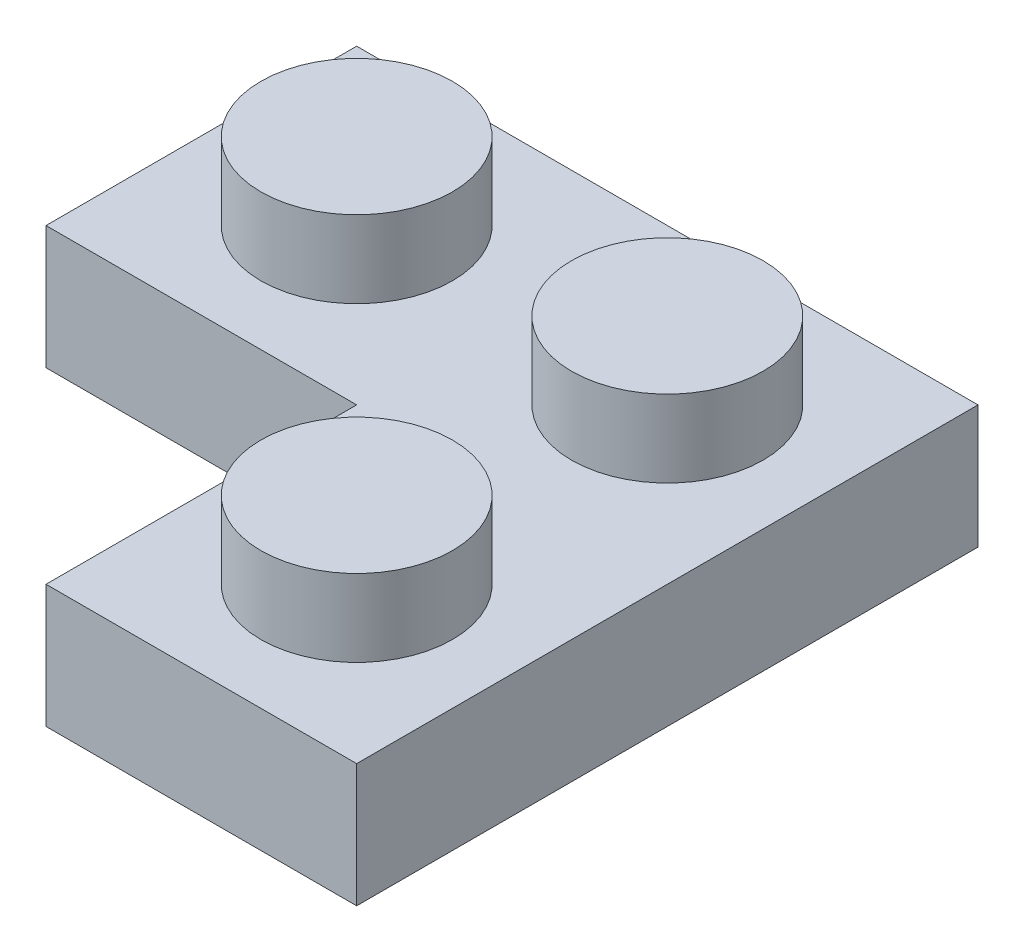
ISO-10303-21;
HEADER;
FILE_DESCRIPTION(('STEP AP214'),'2;1');
FILE_NAME('part.step','',(''),(''),'','','');
FILE_SCHEMA(('AUTOMOTIVE_DESIGN { 1 0 10303 214 1 1 1 1 }'));
ENDSEC;
DATA;
#1=APPLICATION_CONTEXT('core data for automotive mechanical design processes');
#2=APPLICATION_PROTOCOL_DEFINITION('international standard','automotive_design',2000,#1);
#3=PRODUCT_CONTEXT('',#1,'mechanical');
#4=PRODUCT('Part','Part','',(#3));
#5=PRODUCT_RELATED_PRODUCT_CATEGORY('part','',(#4));
#6=PRODUCT_DEFINITION_FORMATION('','',#4);
#7=PRODUCT_DEFINITION_CONTEXT('part definition',#1,'design');
#8=PRODUCT_DEFINITION('design','',#6,#7);
#9=PRODUCT_DEFINITION_SHAPE('','',#8);
#10=(LENGTH_UNIT() NAMED_UNIT(*) SI_UNIT(.MILLI.,.METRE.));
#11=(NAMED_UNIT(*) PLANE_ANGLE_UNIT() SI_UNIT($,.RADIAN.));
#12=(NAMED_UNIT(*) SI_UNIT($,.STERADIAN.) SOLID_ANGLE_UNIT());
#13=UNCERTAINTY_MEASURE_WITH_UNIT(LENGTH_MEASURE(1.E-05),#10,'distance_accuracy_value','');
#14=(GEOMETRIC_REPRESENTATION_CONTEXT(3) GLOBAL_UNCERTAINTY_ASSIGNED_CONTEXT((#13)) GLOBAL_UNIT_ASSIGNED_CONTEXT((#10,
#11,#12)) REPRESENTATION_CONTEXT('',''));
#15=CARTESIAN_POINT('',(0.,0.,0.));
#16=DIRECTION('',(0.,0.,1.));
#17=DIRECTION('',(1.,0.,0.));
#18=AXIS2_PLACEMENT_3D('',#15,#16,#17);
#19=CARTESIAN_POINT('',(0.,-3.15,0.));
#20=DIRECTION('',(0.,-1.,0.));
#21=DIRECTION('',(0.,0.,-1.));
#22=AXIS2_PLACEMENT_3D('',#19,#20,#21);
#23=PLANE('',#22);
#24=DIRECTION('',(1.,0.,0.));
#25=VECTOR('',#24,1.);
#26=CARTESIAN_POINT('',(-7.945,-3.15,0.));
#27=LINE('',#26,#25);
#28=CARTESIAN_POINT('',(-7.945,-3.15,0.));
#29=VERTEX_POINT('',#28);
#30=CARTESIAN_POINT('',(0.,-3.15,0.));
#31=VERTEX_POINT('',#30);
#32=EDGE_CURVE('E151',#29,#31,#27,.T.);
#33=ORIENTED_EDGE('',*,*,#32,.F.);
#34=DIRECTION('',(0.,0.,1.));
#35=VECTOR('',#34,1.);
#36=CARTESIAN_POINT('',(-7.945,-3.15,-7.945));
#37=LINE('',#36,#35);
#38=CARTESIAN_POINT('',(-7.945,-3.15,-7.945));
#39=VERTEX_POINT('',#38);
#40=EDGE_CURVE('E125',#39,#29,#37,.T.);
#41=ORIENTED_EDGE('',*,*,#40,.F.);
#42=DIRECTION('',(-1.,0.,0.));
#43=VECTOR('',#42,1.);
#44=CARTESIAN_POINT('',(7.945,-3.15,-7.945));
#45=LINE('',#44,#43);
#46=CARTESIAN_POINT('',(7.945,-3.15,-7.945));
#47=VERTEX_POINT('',#46);
#48=EDGE_CURVE('E108',#47,#39,#45,.T.);
#49=ORIENTED_EDGE('',*,*,#48,.F.);
#50=DIRECTION('',(0.,0.,-1.));
#51=VECTOR('',#50,1.);
#52=CARTESIAN_POINT('',(7.945,-3.15,7.945));
#53=LINE('',#52,#51);
#54=CARTESIAN_POINT('',(7.945,-3.15,7.945));
#55=VERTEX_POINT('',#54);
#56=EDGE_CURVE('E123',#55,#47,#53,.T.);
#57=ORIENTED_EDGE('',*,*,#56,.F.);
#58=DIRECTION('',(1.,0.,0.));
#59=VECTOR('',#58,1.);
#60=CARTESIAN_POINT('',(0.,-3.15,7.945));
#61=LINE('',#60,#59);
#62=CARTESIAN_POINT('',(0.,-3.15,7.945));
#63=VERTEX_POINT('',#62);
#64=EDGE_CURVE('E128',#63,#55,#61,.T.);
#65=ORIENTED_EDGE('',*,*,#64,.F.);
#66=DIRECTION('',(0.,0.,1.));
#67=VECTOR('',#66,1.);
#68=CARTESIAN_POINT('',(0.,-3.15,0.));
#69=LINE('',#68,#67);
#70=EDGE_CURVE('E130',#31,#63,#69,.T.);
#71=ORIENTED_EDGE('',*,*,#70,.F.);
#72=EDGE_LOOP('',(#33,#41,#49,#57,#65,#71));
#73=FACE_BOUND('',#72,.T.);
#74=DIRECTION('',(0.,0.,1.));
#75=VECTOR('',#74,1.);
#76=CARTESIAN_POINT('',(-6.395,-3.15,-7.945));
#77=LINE('',#76,#75);
#78=CARTESIAN_POINT('',(-6.395,-3.15,-6.395));
#79=VERTEX_POINT('',#78);
#80=CARTESIAN_POINT('',(-6.395,-3.15,-1.55));
#81=VERTEX_POINT('',#80);
#82=EDGE_CURVE('E248',#79,#81,#77,.T.);
#83=ORIENTED_EDGE('',*,*,#82,.T.);
#84=DIRECTION('',(1.,0.,0.));
#85=VECTOR('',#84,1.);
#86=CARTESIAN_POINT('',(-7.945,-3.15,-1.55));
#87=LINE('',#86,#85);
#88=CARTESIAN_POINT('',(1.55,-3.15,-1.55));
#89=VERTEX_POINT('',#88);
#90=EDGE_CURVE('E240',#81,#89,#87,.T.);
#91=ORIENTED_EDGE('',*,*,#90,.T.);
#92=DIRECTION('',(0.,0.,1.));
#93=VECTOR('',#92,1.);
#94=CARTESIAN_POINT('',(1.55,-3.15,0.));
#95=LINE('',#94,#93);
#96=CARTESIAN_POINT('',(1.55,-3.15,6.395));
#97=VERTEX_POINT('',#96);
#98=EDGE_CURVE('E237',#89,#97,#95,.T.);
#99=ORIENTED_EDGE('',*,*,#98,.T.);
#100=DIRECTION('',(1.,0.,0.));
#101=VECTOR('',#100,1.);
#102=CARTESIAN_POINT('',(0.,-3.15,6.395));
#103=LINE('',#102,#101);
#104=CARTESIAN_POINT('',(6.395,-3.15,6.395));
#105=VERTEX_POINT('',#104);
#106=EDGE_CURVE('E49',#97,#105,#103,.T.);
#107=ORIENTED_EDGE('',*,*,#106,.T.);
#108=DIRECTION('',(0.,0.,-1.));
#109=VECTOR('',#108,1.);
#110=CARTESIAN_POINT('',(6.395,-3.15,7.945));
#111=LINE('',#110,#109);
#112=CARTESIAN_POINT('',(6.395,-3.15,-6.395));
#113=VERTEX_POINT('',#112);
#114=EDGE_CURVE('E242',#105,#113,#111,.T.);
#115=ORIENTED_EDGE('',*,*,#114,.T.);
#116=DIRECTION('',(-1.,0.,0.));
#117=VECTOR('',#116,1.);
#118=CARTESIAN_POINT('',(7.945,-3.15,-6.395));
#119=LINE('',#118,#117);
#120=EDGE_CURVE('E245',#113,#79,#119,.T.);
#121=ORIENTED_EDGE('',*,*,#120,.T.);
#122=EDGE_LOOP('',(#83,#91,#99,#107,#115,#121));
#123=FACE_BOUND('',#122,.T.);
#124=ADVANCED_FACE('F34',(#73,#123),#23,.T.);
#125=CARTESIAN_POINT('',(-7.945,-3.15,0.));
#126=DIRECTION('',(0.,0.,1.));
#127=DIRECTION('',(1.,0.,0.));
#128=AXIS2_PLACEMENT_3D('',#125,#126,#127);
#129=PLANE('',#128);
#130=DIRECTION('',(1.,0.,0.));
#131=VECTOR('',#130,1.);
#132=CARTESIAN_POINT('',(-7.945,0.,0.));
#133=LINE('',#132,#131);
#134=CARTESIAN_POINT('',(-7.945,0.,0.));
#135=VERTEX_POINT('',#134);
#136=CARTESIAN_POINT('',(0.,0.,0.));
#137=VERTEX_POINT('',#136);
#138=EDGE_CURVE('E135',#135,#137,#133,.T.);
#139=ORIENTED_EDGE('',*,*,#138,.F.);
#140=DIRECTION('',(0.,1.,0.));
#141=VECTOR('',#140,1.);
#142=CARTESIAN_POINT('',(-7.945,-3.15,0.));
#143=LINE('',#142,#141);
#144=EDGE_CURVE('E58',#29,#135,#143,.T.);
#145=ORIENTED_EDGE('',*,*,#144,.F.);
#146=ORIENTED_EDGE('',*,*,#32,.T.);
#147=DIRECTION('',(0.,1.,0.));
#148=VECTOR('',#147,1.);
#149=CARTESIAN_POINT('',(0.,-3.15,0.));
#150=LINE('',#149,#148);
#151=EDGE_CURVE('E91',#31,#137,#150,.T.);
#152=ORIENTED_EDGE('',*,*,#151,.T.);
#153=EDGE_LOOP('',(#139,#145,#146,#152));
#154=FACE_BOUND('',#153,.T.);
#155=ADVANCED_FACE('F36',(#154),#129,.T.);
#156=CARTESIAN_POINT('',(-7.945,-3.15,-7.945));
#157=DIRECTION('',(-1.,0.,0.));
#158=DIRECTION('',(0.,0.,1.));
#159=AXIS2_PLACEMENT_3D('',#156,#157,#158);
#160=PLANE('',#159);
#161=DIRECTION('',(0.,0.,1.));
#162=VECTOR('',#161,1.);
#163=CARTESIAN_POINT('',(-7.945,0.,-7.945));
#164=LINE('',#163,#162);
#165=CARTESIAN_POINT('',(-7.945,0.,-7.945));
#166=VERTEX_POINT('',#165);
#167=EDGE_CURVE('E148',#166,#135,#164,.T.);
#168=ORIENTED_EDGE('',*,*,#167,.F.);
#169=DIRECTION('',(0.,1.,0.));
#170=VECTOR('',#169,1.);
#171=CARTESIAN_POINT('',(-7.945,-3.15,-7.945));
#172=LINE('',#171,#170);
#173=EDGE_CURVE('E116',#39,#166,#172,.T.);
#174=ORIENTED_EDGE('',*,*,#173,.F.);
#175=ORIENTED_EDGE('',*,*,#40,.T.);
#176=ORIENTED_EDGE('',*,*,#144,.T.);
#177=EDGE_LOOP('',(#168,#174,#175,#176));
#178=FACE_BOUND('',#177,.T.);
#179=ADVANCED_FACE('F202',(#178),#160,.T.);
#180=CARTESIAN_POINT('',(7.945,-3.15,-7.945));
#181=DIRECTION('',(0.,0.,-1.));
#182=DIRECTION('',(-1.,0.,0.));
#183=AXIS2_PLACEMENT_3D('',#180,#181,#182);
#184=PLANE('',#183);
#185=DIRECTION('',(-1.,0.,0.));
#186=VECTOR('',#185,1.);
#187=CARTESIAN_POINT('',(7.945,0.,-7.945));
#188=LINE('',#187,#186);
#189=CARTESIAN_POINT('',(7.945,0.,-7.945));
#190=VERTEX_POINT('',#189);
#191=EDGE_CURVE('E111',#190,#166,#188,.T.);
#192=ORIENTED_EDGE('',*,*,#191,.F.);
#193=DIRECTION('',(0.,1.,0.));
#194=VECTOR('',#193,1.);
#195=CARTESIAN_POINT('',(7.945,-3.15,-7.945));
#196=LINE('',#195,#194);
#197=EDGE_CURVE('E105',#47,#190,#196,.T.);
#198=ORIENTED_EDGE('',*,*,#197,.F.);
#199=ORIENTED_EDGE('',*,*,#48,.T.);
#200=ORIENTED_EDGE('',*,*,#173,.T.);
#201=EDGE_LOOP('',(#192,#198,#199,#200));
#202=FACE_BOUND('',#201,.T.);
#203=ADVANCED_FACE('F107',(#202),#184,.T.);
#204=CARTESIAN_POINT('',(7.945,-3.15,7.945));
#205=DIRECTION('',(1.,0.,0.));
#206=DIRECTION('',(0.,0.,-1.));
#207=AXIS2_PLACEMENT_3D('',#204,#205,#206);
#208=PLANE('',#207);
#209=DIRECTION('',(0.,0.,-1.));
#210=VECTOR('',#209,1.);
#211=CARTESIAN_POINT('',(7.945,0.,7.945));
#212=LINE('',#211,#210);
#213=CARTESIAN_POINT('',(7.945,0.,7.945));
#214=VERTEX_POINT('',#213);
#215=EDGE_CURVE('E145',#214,#190,#212,.T.);
#216=ORIENTED_EDGE('',*,*,#215,.F.);
#217=DIRECTION('',(0.,1.,0.));
#218=VECTOR('',#217,1.);
#219=CARTESIAN_POINT('',(7.945,-3.15,7.945));
#220=LINE('',#219,#218);
#221=EDGE_CURVE('E117',#55,#214,#220,.T.);
#222=ORIENTED_EDGE('',*,*,#221,.F.);
#223=ORIENTED_EDGE('',*,*,#56,.T.);
#224=ORIENTED_EDGE('',*,*,#197,.T.);
#225=EDGE_LOOP('',(#216,#222,#223,#224));
#226=FACE_BOUND('',#225,.T.);
#227=ADVANCED_FACE('F127',(#226),#208,.T.);
#228=CARTESIAN_POINT('',(0.,-3.15,7.945));
#229=DIRECTION('',(0.,0.,1.));
#230=DIRECTION('',(1.,0.,0.));
#231=AXIS2_PLACEMENT_3D('',#228,#229,#230);
#232=PLANE('',#231);
#233=DIRECTION('',(1.,0.,0.));
#234=VECTOR('',#233,1.);
#235=CARTESIAN_POINT('',(0.,0.,7.945));
#236=LINE('',#235,#234);
#237=CARTESIAN_POINT('',(0.,0.,7.945));
#238=VERTEX_POINT('',#237);
#239=EDGE_CURVE('E142',#238,#214,#236,.T.);
#240=ORIENTED_EDGE('',*,*,#239,.F.);
#241=DIRECTION('',(0.,1.,0.));
#242=VECTOR('',#241,1.);
#243=CARTESIAN_POINT('',(0.,-3.15,7.945));
#244=LINE('',#243,#242);
#245=EDGE_CURVE('E156',#63,#238,#244,.T.);
#246=ORIENTED_EDGE('',*,*,#245,.F.);
#247=ORIENTED_EDGE('',*,*,#64,.T.);
#248=ORIENTED_EDGE('',*,*,#221,.T.);
#249=EDGE_LOOP('',(#240,#246,#247,#248));
#250=FACE_BOUND('',#249,.T.);
#251=ADVANCED_FACE('F218',(#250),#232,.T.);
#252=CARTESIAN_POINT('',(0.,-3.15,0.));
#253=DIRECTION('',(-1.,0.,0.));
#254=DIRECTION('',(0.,0.,1.));
#255=AXIS2_PLACEMENT_3D('',#252,#253,#254);
#256=PLANE('',#255);
#257=DIRECTION('',(0.,0.,1.));
#258=VECTOR('',#257,1.);
#259=CARTESIAN_POINT('',(0.,0.,0.));
#260=LINE('',#259,#258);
#261=EDGE_CURVE('E138',#137,#238,#260,.T.);
#262=ORIENTED_EDGE('',*,*,#261,.F.);
#263=ORIENTED_EDGE('',*,*,#151,.F.);
#264=ORIENTED_EDGE('',*,*,#70,.T.);
#265=ORIENTED_EDGE('',*,*,#245,.T.);
#266=EDGE_LOOP('',(#262,#263,#264,#265));
#267=FACE_BOUND('',#266,.T.);
#268=ADVANCED_FACE('F210',(#267),#256,.T.);
#269=CARTESIAN_POINT('',(0.,0.,0.));
#270=DIRECTION('',(0.,-1.,0.));
#271=DIRECTION('',(0.,0.,-1.));
#272=AXIS2_PLACEMENT_3D('',#269,#270,#271);
#273=PLANE('',#272);
#274=CARTESIAN_POINT('',(-3.9725,0.,-3.9725));
#275=DIRECTION('',(0.,-1.,0.));
#276=DIRECTION('',(0.,0.,-1.));
#277=AXIS2_PLACEMENT_3D('',#274,#275,#276);
#278=CIRCLE('',#277,2.45);
#279=CARTESIAN_POINT('',(-3.9725,0.,-6.4225));
#280=VERTEX_POINT('',#279);
#281=EDGE_CURVE('E164',#280,#280,#278,.F.);
#282=ORIENTED_EDGE('',*,*,#281,.F.);
#283=EDGE_LOOP('',(#282));
#284=FACE_BOUND('',#283,.T.);
#285=CARTESIAN_POINT('',(3.9725,0.,3.9725));
#286=DIRECTION('',(0.,-1.,0.));
#287=DIRECTION('',(0.,0.,-1.));
#288=AXIS2_PLACEMENT_3D('',#285,#286,#287);
#289=CIRCLE('',#288,2.45);
#290=CARTESIAN_POINT('',(3.9725,0.,1.5225));
#291=VERTEX_POINT('',#290);
#292=EDGE_CURVE('E161',#291,#291,#289,.F.);
#293=ORIENTED_EDGE('',*,*,#292,.F.);
#294=EDGE_LOOP('',(#293));
#295=FACE_BOUND('',#294,.T.);
#296=CARTESIAN_POINT('',(3.9725,0.,-3.9725));
#297=DIRECTION('',(0.,-1.,0.));
#298=DIRECTION('',(0.,0.,-1.));
#299=AXIS2_PLACEMENT_3D('',#296,#297,#298);
#300=CIRCLE('',#299,2.45);
#301=CARTESIAN_POINT('',(3.9725,0.,-6.4225));
#302=VERTEX_POINT('',#301);
#303=EDGE_CURVE('E153',#302,#302,#300,.F.);
#304=ORIENTED_EDGE('',*,*,#303,.F.);
#305=EDGE_LOOP('',(#304));
#306=FACE_BOUND('',#305,.T.);
#307=ORIENTED_EDGE('',*,*,#138,.T.);
#308=ORIENTED_EDGE('',*,*,#261,.T.);
#309=ORIENTED_EDGE('',*,*,#239,.T.);
#310=ORIENTED_EDGE('',*,*,#215,.T.);
#311=ORIENTED_EDGE('',*,*,#191,.T.);
#312=ORIENTED_EDGE('',*,*,#167,.T.);
#313=EDGE_LOOP('',(#307,#308,#309,#310,#311,#312));
#314=FACE_BOUND('',#313,.T.);
#315=ADVANCED_FACE('F207',(#284,#295,#306,#314),#273,.F.);
#316=CARTESIAN_POINT('',(3.9725,1.97,-3.9725));
#317=DIRECTION('',(0.,-1.,0.));
#318=DIRECTION('',(0.,0.,-1.));
#319=AXIS2_PLACEMENT_3D('',#316,#317,#318);
#320=CYLINDRICAL_SURFACE('',#319,2.45);
#321=CARTESIAN_POINT('',(3.9725,1.97,-3.9725));
#322=DIRECTION('',(0.,1.,0.));
#323=DIRECTION('',(0.,0.,1.));
#324=AXIS2_PLACEMENT_3D('',#321,#322,#323);
#325=CIRCLE('',#324,2.45);
#326=CARTESIAN_POINT('',(3.9725,1.97,-1.5225));
#327=VERTEX_POINT('',#326);
#328=EDGE_CURVE('E139',#327,#327,#325,.T.);
#329=ORIENTED_EDGE('',*,*,#328,.F.);
#330=EDGE_LOOP('',(#329));
#331=FACE_BOUND('',#330,.T.);
#332=ORIENTED_EDGE('',*,*,#303,.T.);
#333=EDGE_LOOP('',(#332));
#334=FACE_BOUND('',#333,.T.);
#335=ADVANCED_FACE('F205',(#331,#334),#320,.T.);
#336=CARTESIAN_POINT('',(3.9725,1.97,-3.9725));
#337=DIRECTION('',(0.,1.,0.));
#338=DIRECTION('',(0.,0.,1.));
#339=AXIS2_PLACEMENT_3D('',#336,#337,#338);
#340=PLANE('',#339);
#341=ORIENTED_EDGE('',*,*,#328,.T.);
#342=EDGE_LOOP('',(#341));
#343=FACE_BOUND('',#342,.T.);
#344=ADVANCED_FACE('F573',(#343),#340,.T.);
#345=CARTESIAN_POINT('',(3.9725,1.97,3.9725));
#346=DIRECTION('',(0.,-1.,0.));
#347=DIRECTION('',(0.,0.,-1.));
#348=AXIS2_PLACEMENT_3D('',#345,#346,#347);
#349=CYLINDRICAL_SURFACE('',#348,2.45);
#350=CARTESIAN_POINT('',(3.9725,1.97,3.9725));
#351=DIRECTION('',(0.,1.,0.));
#352=DIRECTION('',(0.,0.,1.));
#353=AXIS2_PLACEMENT_3D('',#350,#351,#352);
#354=CIRCLE('',#353,2.45);
#355=CARTESIAN_POINT('',(3.9725,1.97,6.4225));
#356=VERTEX_POINT('',#355);
#357=EDGE_CURVE('E230',#356,#356,#354,.T.);
#358=ORIENTED_EDGE('',*,*,#357,.F.);
#359=EDGE_LOOP('',(#358));
#360=FACE_BOUND('',#359,.T.);
#361=ORIENTED_EDGE('',*,*,#292,.T.);
#362=EDGE_LOOP('',(#361));
#363=FACE_BOUND('',#362,.T.);
#364=ADVANCED_FACE('F564',(#360,#363),#349,.T.);
#365=CARTESIAN_POINT('',(3.9725,1.97,3.9725));
#366=DIRECTION('',(0.,1.,0.));
#367=DIRECTION('',(0.,0.,1.));
#368=AXIS2_PLACEMENT_3D('',#365,#366,#367);
#369=PLANE('',#368);
#370=ORIENTED_EDGE('',*,*,#357,.T.);
#371=EDGE_LOOP('',(#370));
#372=FACE_BOUND('',#371,.T.);
#373=ADVANCED_FACE('F555',(#372),#369,.T.);
#374=CARTESIAN_POINT('',(-3.9725,1.97,-3.9725));
#375=DIRECTION('',(0.,-1.,0.));
#376=DIRECTION('',(0.,0.,-1.));
#377=AXIS2_PLACEMENT_3D('',#374,#375,#376);
#378=CYLINDRICAL_SURFACE('',#377,2.45);
#379=CARTESIAN_POINT('',(-3.9725,1.97,-3.9725));
#380=DIRECTION('',(0.,1.,0.));
#381=DIRECTION('',(0.,0.,1.));
#382=AXIS2_PLACEMENT_3D('',#379,#380,#381);
#383=CIRCLE('',#382,2.45);
#384=CARTESIAN_POINT('',(-3.9725,1.97,-1.5225));
#385=VERTEX_POINT('',#384);
#386=EDGE_CURVE('E233',#385,#385,#383,.T.);
#387=ORIENTED_EDGE('',*,*,#386,.F.);
#388=EDGE_LOOP('',(#387));
#389=FACE_BOUND('',#388,.T.);
#390=ORIENTED_EDGE('',*,*,#281,.T.);
#391=EDGE_LOOP('',(#390));
#392=FACE_BOUND('',#391,.T.);
#393=ADVANCED_FACE('F546',(#389,#392),#378,.T.);
#394=CARTESIAN_POINT('',(-3.9725,1.97,-3.9725));
#395=DIRECTION('',(0.,1.,0.));
#396=DIRECTION('',(0.,0.,1.));
#397=AXIS2_PLACEMENT_3D('',#394,#395,#396);
#398=PLANE('',#397);
#399=ORIENTED_EDGE('',*,*,#386,.T.);
#400=EDGE_LOOP('',(#399));
#401=FACE_BOUND('',#400,.T.);
#402=ADVANCED_FACE('F346',(#401),#398,.T.);
#403=CARTESIAN_POINT('',(-7.945,-3.15,-1.55));
#404=DIRECTION('',(0.,0.,1.));
#405=DIRECTION('',(1.,0.,0.));
#406=AXIS2_PLACEMENT_3D('',#403,#404,#405);
#407=PLANE('',#406);
#408=DIRECTION('',(1.,0.,0.));
#409=VECTOR('',#408,1.);
#410=CARTESIAN_POINT('',(-7.945,-1.55,-1.55));
#411=LINE('',#410,#409);
#412=CARTESIAN_POINT('',(-6.395,-1.55,-1.55));
#413=VERTEX_POINT('',#412);
#414=CARTESIAN_POINT('',(1.55,-1.55,-1.55));
#415=VERTEX_POINT('',#414);
#416=EDGE_CURVE('E265',#413,#415,#411,.T.);
#417=ORIENTED_EDGE('',*,*,#416,.T.);
#418=DIRECTION('',(0.,1.,0.));
#419=VECTOR('',#418,1.);
#420=CARTESIAN_POINT('',(1.55,-3.15,-1.55));
#421=LINE('',#420,#419);
#422=EDGE_CURVE('E251',#89,#415,#421,.T.);
#423=ORIENTED_EDGE('',*,*,#422,.F.);
#424=ORIENTED_EDGE('',*,*,#90,.F.);
#425=DIRECTION('',(0.,1.,0.));
#426=VECTOR('',#425,1.);
#427=CARTESIAN_POINT('',(-6.395,-3.15,-1.55));
#428=LINE('',#427,#426);
#429=EDGE_CURVE('E270',#81,#413,#428,.T.);
#430=ORIENTED_EDGE('',*,*,#429,.T.);
#431=EDGE_LOOP('',(#417,#423,#424,#430));
#432=FACE_BOUND('',#431,.T.);
#433=ADVANCED_FACE('F342',(#432),#407,.F.);
#434=CARTESIAN_POINT('',(-6.395,-3.15,-7.945));
#435=DIRECTION('',(-1.,0.,0.));
#436=DIRECTION('',(0.,0.,1.));
#437=AXIS2_PLACEMENT_3D('',#434,#435,#436);
#438=PLANE('',#437);
#439=DIRECTION('',(0.,0.,1.));
#440=VECTOR('',#439,1.);
#441=CARTESIAN_POINT('',(-6.395,-1.55,-7.945));
#442=LINE('',#441,#440);
#443=CARTESIAN_POINT('',(-6.395,-1.55,-6.395));
#444=VERTEX_POINT('',#443);
#445=EDGE_CURVE('E254',#444,#413,#442,.T.);
#446=ORIENTED_EDGE('',*,*,#445,.T.);
#447=ORIENTED_EDGE('',*,*,#429,.F.);
#448=ORIENTED_EDGE('',*,*,#82,.F.);
#449=DIRECTION('',(0.,1.,0.));
#450=VECTOR('',#449,1.);
#451=CARTESIAN_POINT('',(-6.395,-3.15,-6.395));
#452=LINE('',#451,#450);
#453=EDGE_CURVE('E293',#79,#444,#452,.T.);
#454=ORIENTED_EDGE('',*,*,#453,.T.);
#455=EDGE_LOOP('',(#446,#447,#448,#454));
#456=FACE_BOUND('',#455,.T.);
#457=ADVANCED_FACE('F345',(#456),#438,.F.);
#458=CARTESIAN_POINT('',(7.945,-3.15,-6.395));
#459=DIRECTION('',(0.,0.,-1.));
#460=DIRECTION('',(-1.,0.,0.));
#461=AXIS2_PLACEMENT_3D('',#458,#459,#460);
#462=PLANE('',#461);
#463=DIRECTION('',(-1.,0.,0.));
#464=VECTOR('',#463,1.);
#465=CARTESIAN_POINT('',(7.945,-1.55,-6.395));
#466=LINE('',#465,#464);
#467=CARTESIAN_POINT('',(6.395,-1.55,-6.395));
#468=VERTEX_POINT('',#467);
#469=EDGE_CURVE('E290',#468,#444,#466,.T.);
#470=ORIENTED_EDGE('',*,*,#469,.T.);
#471=ORIENTED_EDGE('',*,*,#453,.F.);
#472=ORIENTED_EDGE('',*,*,#120,.F.);
#473=DIRECTION('',(0.,1.,0.));
#474=VECTOR('',#473,1.);
#475=CARTESIAN_POINT('',(6.395,-3.15,-6.395));
#476=LINE('',#475,#474);
#477=EDGE_CURVE('E287',#113,#468,#476,.T.);
#478=ORIENTED_EDGE('',*,*,#477,.T.);
#479=EDGE_LOOP('',(#470,#471,#472,#478));
#480=FACE_BOUND('',#479,.T.);
#481=ADVANCED_FACE('F350',(#480),#462,.F.);
#482=CARTESIAN_POINT('',(6.395,-3.15,7.945));
#483=DIRECTION('',(1.,0.,0.));
#484=DIRECTION('',(0.,0.,-1.));
#485=AXIS2_PLACEMENT_3D('',#482,#483,#484);
#486=PLANE('',#485);
#487=DIRECTION('',(0.,0.,-1.));
#488=VECTOR('',#487,1.);
#489=CARTESIAN_POINT('',(6.395,-1.55,7.945));
#490=LINE('',#489,#488);
#491=CARTESIAN_POINT('',(6.395,-1.55,6.395));
#492=VERTEX_POINT('',#491);
#493=EDGE_CURVE('E284',#492,#468,#490,.T.);
#494=ORIENTED_EDGE('',*,*,#493,.T.);
#495=ORIENTED_EDGE('',*,*,#477,.F.);
#496=ORIENTED_EDGE('',*,*,#114,.F.);
#497=DIRECTION('',(0.,1.,0.));
#498=VECTOR('',#497,1.);
#499=CARTESIAN_POINT('',(6.395,-3.15,6.395));
#500=LINE('',#499,#498);
#501=EDGE_CURVE('E281',#105,#492,#500,.T.);
#502=ORIENTED_EDGE('',*,*,#501,.T.);
#503=EDGE_LOOP('',(#494,#495,#496,#502));
#504=FACE_BOUND('',#503,.T.);
#505=ADVANCED_FACE('F354',(#504),#486,.F.);
#506=CARTESIAN_POINT('',(0.,-3.15,6.395));
#507=DIRECTION('',(0.,0.,1.));
#508=DIRECTION('',(1.,0.,0.));
#509=AXIS2_PLACEMENT_3D('',#506,#507,#508);
#510=PLANE('',#509);
#511=DIRECTION('',(1.,0.,0.));
#512=VECTOR('',#511,1.);
#513=CARTESIAN_POINT('',(0.,-1.55,6.395));
#514=LINE('',#513,#512);
#515=CARTESIAN_POINT('',(1.55,-1.55,6.395));
#516=VERTEX_POINT('',#515);
#517=EDGE_CURVE('E278',#516,#492,#514,.T.);
#518=ORIENTED_EDGE('',*,*,#517,.T.);
#519=ORIENTED_EDGE('',*,*,#501,.F.);
#520=ORIENTED_EDGE('',*,*,#106,.F.);
#521=DIRECTION('',(0.,1.,0.));
#522=VECTOR('',#521,1.);
#523=CARTESIAN_POINT('',(1.55,-3.15,6.395));
#524=LINE('',#523,#522);
#525=EDGE_CURVE('E279',#97,#516,#524,.T.);
#526=ORIENTED_EDGE('',*,*,#525,.T.);
#527=EDGE_LOOP('',(#518,#519,#520,#526));
#528=FACE_BOUND('',#527,.T.);
#529=ADVANCED_FACE('F358',(#528),#510,.F.);
#530=CARTESIAN_POINT('',(1.55,-3.15,0.));
#531=DIRECTION('',(-1.,0.,0.));
#532=DIRECTION('',(0.,0.,1.));
#533=AXIS2_PLACEMENT_3D('',#530,#531,#532);
#534=PLANE('',#533);
#535=DIRECTION('',(0.,0.,1.));
#536=VECTOR('',#535,1.);
#537=CARTESIAN_POINT('',(1.55,-1.55,0.));
#538=LINE('',#537,#536);
#539=EDGE_CURVE('E275',#415,#516,#538,.T.);
#540=ORIENTED_EDGE('',*,*,#539,.T.);
#541=ORIENTED_EDGE('',*,*,#525,.F.);
#542=ORIENTED_EDGE('',*,*,#98,.F.);
#543=ORIENTED_EDGE('',*,*,#422,.T.);
#544=EDGE_LOOP('',(#540,#541,#542,#543));
#545=FACE_BOUND('',#544,.T.);
#546=ADVANCED_FACE('F192',(#545),#534,.F.);
#547=CARTESIAN_POINT('',(0.,-1.55,0.));
#548=DIRECTION('',(0.,-1.,0.));
#549=DIRECTION('',(0.,0.,-1.));
#550=AXIS2_PLACEMENT_3D('',#547,#548,#549);
#551=PLANE('',#550);
#552=CARTESIAN_POINT('',(3.97,-1.55,0.));
#553=DIRECTION('',(0.,-1.,0.));
#554=DIRECTION('',(0.,0.,-1.));
#555=AXIS2_PLACEMENT_3D('',#552,#553,#554);
#556=CIRCLE('',#555,1.48);
#557=CARTESIAN_POINT('',(3.97,-1.55,-1.48));
#558=VERTEX_POINT('',#557);
#559=EDGE_CURVE('E318',#558,#558,#556,.T.);
#560=ORIENTED_EDGE('',*,*,#559,.F.);
#561=EDGE_LOOP('',(#560));
#562=FACE_BOUND('',#561,.T.);
#563=CARTESIAN_POINT('',(0.,-1.55,-3.975));
#564=DIRECTION('',(0.,-1.,0.));
#565=DIRECTION('',(0.,0.,-1.));
#566=AXIS2_PLACEMENT_3D('',#563,#564,#565);
#567=CIRCLE('',#566,1.48);
#568=CARTESIAN_POINT('',(0.,-1.55,-5.455));
#569=VERTEX_POINT('',#568);
#570=EDGE_CURVE('E309',#569,#569,#567,.T.);
#571=ORIENTED_EDGE('',*,*,#570,.F.);
#572=EDGE_LOOP('',(#571));
#573=FACE_BOUND('',#572,.T.);
#574=CARTESIAN_POINT('',(-3.9725,-1.55,-3.9725));
#575=DIRECTION('',(0.,-1.,0.));
#576=DIRECTION('',(0.,0.,-1.));
#577=AXIS2_PLACEMENT_3D('',#574,#575,#576);
#578=CIRCLE('',#577,0.900000000000001);
#579=CARTESIAN_POINT('',(-3.9725,-1.55,-4.8725));
#580=VERTEX_POINT('',#579);
#581=EDGE_CURVE('E236',#580,#580,#578,.F.);
#582=ORIENTED_EDGE('',*,*,#581,.T.);
#583=EDGE_LOOP('',(#582));
#584=FACE_BOUND('',#583,.T.);
#585=CARTESIAN_POINT('',(3.9725,-1.55,3.9725));
#586=DIRECTION('',(0.,-1.,0.));
#587=DIRECTION('',(0.,0.,-1.));
#588=AXIS2_PLACEMENT_3D('',#585,#586,#587);
#589=CIRCLE('',#588,0.900000000000001);
#590=CARTESIAN_POINT('',(3.9725,-1.55,3.0725));
#591=VERTEX_POINT('',#590);
#592=EDGE_CURVE('E269',#591,#591,#589,.F.);
#593=ORIENTED_EDGE('',*,*,#592,.T.);
#594=EDGE_LOOP('',(#593));
#595=FACE_BOUND('',#594,.T.);
#596=CARTESIAN_POINT('',(3.9725,-1.55,-3.9725));
#597=DIRECTION('',(0.,-1.,0.));
#598=DIRECTION('',(0.,0.,-1.));
#599=AXIS2_PLACEMENT_3D('',#596,#597,#598);
#600=CIRCLE('',#599,0.900000000000002);
#601=CARTESIAN_POINT('',(3.9725,-1.55,-4.8725));
#602=VERTEX_POINT('',#601);
#603=EDGE_CURVE('E266',#602,#602,#600,.F.);
#604=ORIENTED_EDGE('',*,*,#603,.T.);
#605=EDGE_LOOP('',(#604));
#606=FACE_BOUND('',#605,.T.);
#607=ORIENTED_EDGE('',*,*,#416,.F.);
#608=ORIENTED_EDGE('',*,*,#445,.F.);
#609=ORIENTED_EDGE('',*,*,#469,.F.);
#610=ORIENTED_EDGE('',*,*,#493,.F.);
#611=ORIENTED_EDGE('',*,*,#517,.F.);
#612=ORIENTED_EDGE('',*,*,#539,.F.);
#613=EDGE_LOOP('',(#607,#608,#609,#610,#611,#612));
#614=FACE_BOUND('',#613,.T.);
#615=ADVANCED_FACE('F177',(#562,#573,#584,#595,#606,#614),#551,.T.);
#616=CARTESIAN_POINT('',(3.9725,1.97,-3.9725));
#617=DIRECTION('',(0.,-1.,0.));
#618=DIRECTION('',(0.,0.,-1.));
#619=AXIS2_PLACEMENT_3D('',#616,#617,#618);
#620=CYLINDRICAL_SURFACE('',#619,0.900000000000002);
#621=CARTESIAN_POINT('',(3.9725,0.42,-3.9725));
#622=DIRECTION('',(0.,1.,0.));
#623=DIRECTION('',(0.,0.,1.));
#624=AXIS2_PLACEMENT_3D('',#621,#622,#623);
#625=CIRCLE('',#624,0.900000000000002);
#626=CARTESIAN_POINT('',(3.9725,0.42,-3.0725));
#627=VERTEX_POINT('',#626);
#628=EDGE_CURVE('E262',#627,#627,#625,.T.);
#629=ORIENTED_EDGE('',*,*,#628,.T.);
#630=EDGE_LOOP('',(#629));
#631=FACE_BOUND('',#630,.T.);
#632=ORIENTED_EDGE('',*,*,#603,.F.);
#633=EDGE_LOOP('',(#632));
#634=FACE_BOUND('',#633,.T.);
#635=ADVANCED_FACE('F191',(#631,#634),#620,.F.);
#636=CARTESIAN_POINT('',(3.9725,0.42,-3.9725));
#637=DIRECTION('',(0.,1.,0.));
#638=DIRECTION('',(0.,0.,1.));
#639=AXIS2_PLACEMENT_3D('',#636,#637,#638);
#640=PLANE('',#639);
#641=ORIENTED_EDGE('',*,*,#628,.F.);
#642=EDGE_LOOP('',(#641));
#643=FACE_BOUND('',#642,.T.);
#644=ADVANCED_FACE('F413',(#643),#640,.F.);
#645=CARTESIAN_POINT('',(3.9725,1.97,3.9725));
#646=DIRECTION('',(0.,-1.,0.));
#647=DIRECTION('',(0.,0.,-1.));
#648=AXIS2_PLACEMENT_3D('',#645,#646,#647);
#649=CYLINDRICAL_SURFACE('',#648,0.900000000000001);
#650=CARTESIAN_POINT('',(3.9725,0.42,3.9725));
#651=DIRECTION('',(0.,1.,0.));
#652=DIRECTION('',(0.,0.,1.));
#653=AXIS2_PLACEMENT_3D('',#650,#651,#652);
#654=CIRCLE('',#653,0.900000000000001);
#655=CARTESIAN_POINT('',(3.9725,0.42,4.8725));
#656=VERTEX_POINT('',#655);
#657=EDGE_CURVE('E258',#656,#656,#654,.T.);
#658=ORIENTED_EDGE('',*,*,#657,.T.);
#659=EDGE_LOOP('',(#658));
#660=FACE_BOUND('',#659,.T.);
#661=ORIENTED_EDGE('',*,*,#592,.F.);
#662=EDGE_LOOP('',(#661));
#663=FACE_BOUND('',#662,.T.);
#664=ADVANCED_FACE('F420',(#660,#663),#649,.F.);
#665=CARTESIAN_POINT('',(3.9725,0.42,3.9725));
#666=DIRECTION('',(0.,1.,0.));
#667=DIRECTION('',(0.,0.,1.));
#668=AXIS2_PLACEMENT_3D('',#665,#666,#667);
#669=PLANE('',#668);
#670=ORIENTED_EDGE('',*,*,#657,.F.);
#671=EDGE_LOOP('',(#670));
#672=FACE_BOUND('',#671,.T.);
#673=ADVANCED_FACE('F428',(#672),#669,.F.);
#674=CARTESIAN_POINT('',(-3.9725,1.97,-3.9725));
#675=DIRECTION('',(0.,-1.,0.));
#676=DIRECTION('',(0.,0.,-1.));
#677=AXIS2_PLACEMENT_3D('',#674,#675,#676);
#678=CYLINDRICAL_SURFACE('',#677,0.900000000000001);
#679=CARTESIAN_POINT('',(-3.9725,0.42,-3.9725));
#680=DIRECTION('',(0.,1.,0.));
#681=DIRECTION('',(0.,0.,1.));
#682=AXIS2_PLACEMENT_3D('',#679,#680,#681);
#683=CIRCLE('',#682,0.900000000000001);
#684=CARTESIAN_POINT('',(-3.9725,0.42,-3.0725));
#685=VERTEX_POINT('',#684);
#686=EDGE_CURVE('E255',#685,#685,#683,.T.);
#687=ORIENTED_EDGE('',*,*,#686,.T.);
#688=EDGE_LOOP('',(#687));
#689=FACE_BOUND('',#688,.T.);
#690=ORIENTED_EDGE('',*,*,#581,.F.);
#691=EDGE_LOOP('',(#690));
#692=FACE_BOUND('',#691,.T.);
#693=ADVANCED_FACE('F436',(#689,#692),#678,.F.);
#694=CARTESIAN_POINT('',(-3.9725,0.42,-3.9725));
#695=DIRECTION('',(0.,1.,0.));
#696=DIRECTION('',(0.,0.,1.));
#697=AXIS2_PLACEMENT_3D('',#694,#695,#696);
#698=PLANE('',#697);
#699=ORIENTED_EDGE('',*,*,#686,.F.);
#700=EDGE_LOOP('',(#699));
#701=FACE_BOUND('',#700,.T.);
#702=ADVANCED_FACE('F340',(#701),#698,.F.);
#703=CARTESIAN_POINT('',(0.,-7.33607214462436,-3.975));
#704=DIRECTION('',(0.,1.,0.));
#705=DIRECTION('',(0.,0.,1.));
#706=AXIS2_PLACEMENT_3D('',#703,#704,#705);
#707=CYLINDRICAL_SURFACE('',#706,1.48);
#708=ORIENTED_EDGE('',*,*,#570,.T.);
#709=EDGE_LOOP('',(#708));
#710=FACE_BOUND('',#709,.T.);
#711=CARTESIAN_POINT('',(0.,-2.95,-3.975));
#712=DIRECTION('',(0.,-1.,0.));
#713=DIRECTION('',(0.,0.,-1.));
#714=AXIS2_PLACEMENT_3D('',#711,#712,#713);
#715=CIRCLE('',#714,1.48);
#716=CARTESIAN_POINT('',(0.,-2.95,-5.455));
#717=VERTEX_POINT('',#716);
#718=EDGE_CURVE('E259',#717,#717,#715,.T.);
#719=ORIENTED_EDGE('',*,*,#718,.F.);
#720=EDGE_LOOP('',(#719));
#721=FACE_BOUND('',#720,.T.);
#722=ADVANCED_FACE('F337',(#710,#721),#707,.T.);
#723=CARTESIAN_POINT('',(0.,-7.33607214462436,-3.975));
#724=DIRECTION('',(0.,1.,0.));
#725=DIRECTION('',(0.,0.,1.));
#726=AXIS2_PLACEMENT_3D('',#723,#724,#725);
#727=CYLINDRICAL_SURFACE('',#726,0.54);
#728=CARTESIAN_POINT('',(0.,-1.55,-3.975));
#729=DIRECTION('',(0.,-1.,0.));
#730=DIRECTION('',(0.,0.,-1.));
#731=AXIS2_PLACEMENT_3D('',#728,#729,#730);
#732=CIRCLE('',#731,0.54);
#733=CARTESIAN_POINT('',(0.,-1.55,-4.515));
#734=VERTEX_POINT('',#733);
#735=EDGE_CURVE('E42',#734,#734,#732,.F.);
#736=ORIENTED_EDGE('',*,*,#735,.T.);
#737=EDGE_LOOP('',(#736));
#738=FACE_BOUND('',#737,.T.);
#739=CARTESIAN_POINT('',(0.,-2.95,-3.975));
#740=DIRECTION('',(0.,-1.,0.));
#741=DIRECTION('',(0.,0.,-1.));
#742=AXIS2_PLACEMENT_3D('',#739,#740,#741);
#743=CIRCLE('',#742,0.54);
#744=CARTESIAN_POINT('',(0.,-2.95,-4.515));
#745=VERTEX_POINT('',#744);
#746=EDGE_CURVE('E306',#745,#745,#743,.T.);
#747=ORIENTED_EDGE('',*,*,#746,.T.);
#748=EDGE_LOOP('',(#747));
#749=FACE_BOUND('',#748,.T.);
#750=ADVANCED_FACE('F169',(#738,#749),#727,.F.);
#751=CARTESIAN_POINT('',(0.,-2.95,0.));
#752=DIRECTION('',(0.,-1.,0.));
#753=DIRECTION('',(0.,0.,-1.));
#754=AXIS2_PLACEMENT_3D('',#751,#752,#753);
#755=PLANE('',#754);
#756=ORIENTED_EDGE('',*,*,#746,.F.);
#757=EDGE_LOOP('',(#756));
#758=FACE_BOUND('',#757,.T.);
#759=ORIENTED_EDGE('',*,*,#718,.T.);
#760=EDGE_LOOP('',(#759));
#761=FACE_BOUND('',#760,.T.);
#762=ADVANCED_FACE('F175',(#758,#761),#755,.T.);
#763=ORIENTED_EDGE('',*,*,#735,.F.);
#764=EDGE_LOOP('',(#763));
#765=FACE_BOUND('',#764,.T.);
#766=ADVANCED_FACE('F172',(#765),#551,.T.);
#767=CARTESIAN_POINT('',(3.97,-7.33607214462436,0.));
#768=DIRECTION('',(0.,1.,0.));
#769=DIRECTION('',(0.,0.,1.));
#770=AXIS2_PLACEMENT_3D('',#767,#768,#769);
#771=CYLINDRICAL_SURFACE('',#770,1.48);
#772=ORIENTED_EDGE('',*,*,#559,.T.);
#773=EDGE_LOOP('',(#772));
#774=FACE_BOUND('',#773,.T.);
#775=CARTESIAN_POINT('',(3.97,-2.95,0.));
#776=DIRECTION('',(0.,-1.,0.));
#777=DIRECTION('',(0.,0.,-1.));
#778=AXIS2_PLACEMENT_3D('',#775,#776,#777);
#779=CIRCLE('',#778,1.48);
#780=CARTESIAN_POINT('',(3.97,-2.95,-1.48));
#781=VERTEX_POINT('',#780);
#782=EDGE_CURVE('E310',#781,#781,#779,.T.);
#783=ORIENTED_EDGE('',*,*,#782,.F.);
#784=EDGE_LOOP('',(#783));
#785=FACE_BOUND('',#784,.T.);
#786=ADVANCED_FACE('F174',(#774,#785),#771,.T.);
#787=CARTESIAN_POINT('',(3.97,-7.33607214462436,0.));
#788=DIRECTION('',(0.,1.,0.));
#789=DIRECTION('',(0.,0.,1.));
#790=AXIS2_PLACEMENT_3D('',#787,#788,#789);
#791=CYLINDRICAL_SURFACE('',#790,0.539999999999999);
#792=CARTESIAN_POINT('',(3.97,-1.55,0.));
#793=DIRECTION('',(0.,-1.,0.));
#794=DIRECTION('',(0.,0.,-1.));
#795=AXIS2_PLACEMENT_3D('',#792,#793,#794);
#796=CIRCLE('',#795,0.539999999999999);
#797=CARTESIAN_POINT('',(3.97,-1.55,-0.539999999999999));
#798=VERTEX_POINT('',#797);
#799=EDGE_CURVE('E12',#798,#798,#796,.F.);
#800=ORIENTED_EDGE('',*,*,#799,.T.);
#801=EDGE_LOOP('',(#800));
#802=FACE_BOUND('',#801,.T.);
#803=CARTESIAN_POINT('',(3.97,-2.95,0.));
#804=DIRECTION('',(0.,-1.,0.));
#805=DIRECTION('',(0.,0.,-1.));
#806=AXIS2_PLACEMENT_3D('',#803,#804,#805);
#807=CIRCLE('',#806,0.539999999999999);
#808=CARTESIAN_POINT('',(3.97,-2.95,-0.539999999999999));
#809=VERTEX_POINT('',#808);
#810=EDGE_CURVE('E315',#809,#809,#807,.T.);
#811=ORIENTED_EDGE('',*,*,#810,.T.);
#812=EDGE_LOOP('',(#811));
#813=FACE_BOUND('',#812,.T.);
#814=ADVANCED_FACE('F183',(#802,#813),#791,.F.);
#815=CARTESIAN_POINT('',(0.,-2.95,0.));
#816=DIRECTION('',(0.,-1.,0.));
#817=DIRECTION('',(0.,0.,-1.));
#818=AXIS2_PLACEMENT_3D('',#815,#816,#817);
#819=PLANE('',#818);
#820=ORIENTED_EDGE('',*,*,#810,.F.);
#821=EDGE_LOOP('',(#820));
#822=FACE_BOUND('',#821,.T.);
#823=ORIENTED_EDGE('',*,*,#782,.T.);
#824=EDGE_LOOP('',(#823));
#825=FACE_BOUND('',#824,.T.);
#826=ADVANCED_FACE('F195',(#822,#825),#819,.T.);
#827=ORIENTED_EDGE('',*,*,#799,.F.);
#828=EDGE_LOOP('',(#827));
#829=FACE_BOUND('',#828,.T.);
#830=ADVANCED_FACE('F178',(#829),#551,.T.);
#831=CLOSED_SHELL('',(#124,#155,#179,#203,#227,#251,#268,#315,#335,#344,#364,#373,#393,#402,
#433,#457,#481,#505,#529,#546,#615,#635,#644,#664,#673,#693,#702,#722,#750,#762,#766,#786,#814,
#826,#830));
#832=MANIFOLD_SOLID_BREP('B2',#831);
#833=ADVANCED_BREP_SHAPE_REPRESENTATION('',(#18,#832),#14);
#834=SHAPE_DEFINITION_REPRESENTATION(#9,#833);
ENDSEC;
END-ISO-10303-21;
